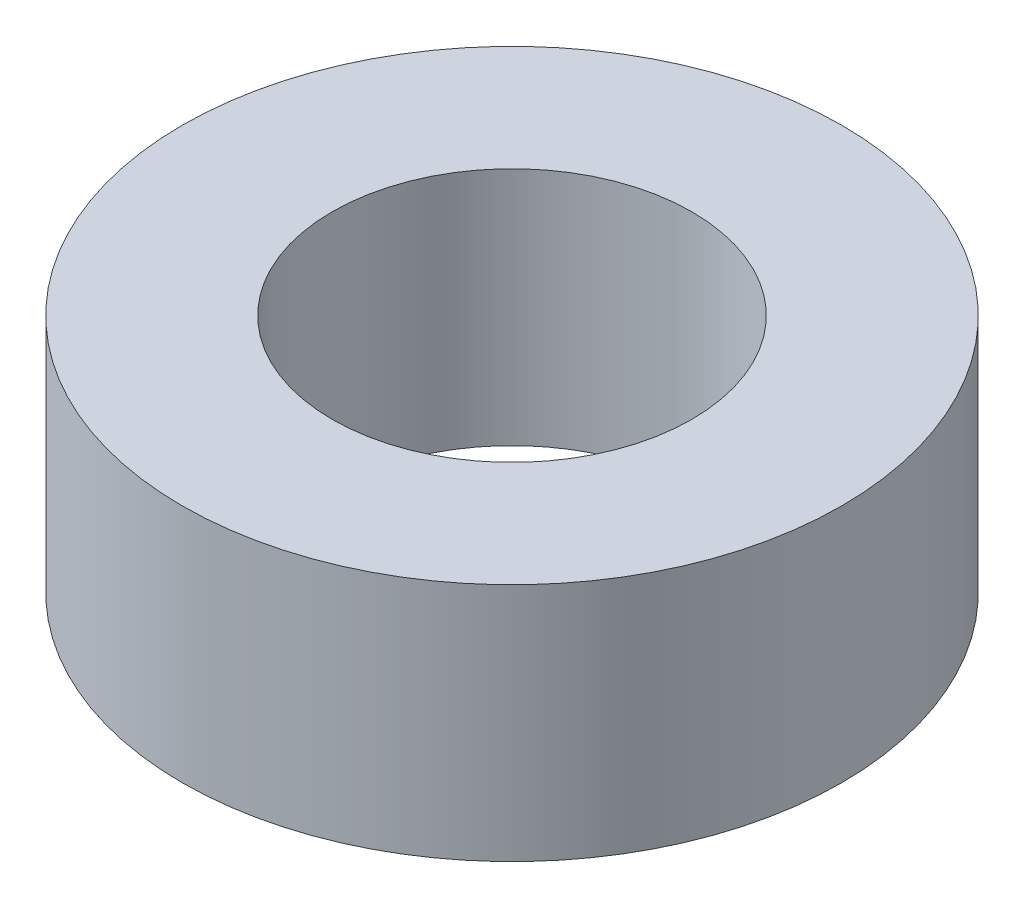
ISO-10303-21;
HEADER;
FILE_DESCRIPTION(('STEP AP214'),'2;1');
FILE_NAME('part.step','',(''),(''),'','','');
FILE_SCHEMA(('AUTOMOTIVE_DESIGN { 1 0 10303 214 1 1 1 1 }'));
ENDSEC;
DATA;
#1=APPLICATION_CONTEXT('core data for automotive mechanical design processes');
#2=APPLICATION_PROTOCOL_DEFINITION('international standard','automotive_design',2000,#1);
#3=PRODUCT_CONTEXT('',#1,'mechanical');
#4=PRODUCT('Part','Part','',(#3));
#5=PRODUCT_RELATED_PRODUCT_CATEGORY('part','',(#4));
#6=PRODUCT_DEFINITION_FORMATION('','',#4);
#7=PRODUCT_DEFINITION_CONTEXT('part definition',#1,'design');
#8=PRODUCT_DEFINITION('design','',#6,#7);
#9=PRODUCT_DEFINITION_SHAPE('','',#8);
#10=(LENGTH_UNIT() NAMED_UNIT(*) SI_UNIT(.MILLI.,.METRE.));
#11=(NAMED_UNIT(*) PLANE_ANGLE_UNIT() SI_UNIT($,.RADIAN.));
#12=(NAMED_UNIT(*) SI_UNIT($,.STERADIAN.) SOLID_ANGLE_UNIT());
#13=UNCERTAINTY_MEASURE_WITH_UNIT(LENGTH_MEASURE(1.E-05),#10,'distance_accuracy_value','');
#14=(GEOMETRIC_REPRESENTATION_CONTEXT(3) GLOBAL_UNCERTAINTY_ASSIGNED_CONTEXT((#13)) GLOBAL_UNIT_ASSIGNED_CONTEXT((#10,
#11,#12)) REPRESENTATION_CONTEXT('',''));
#15=CARTESIAN_POINT('',(0.,0.,0.));
#16=DIRECTION('',(0.,0.,1.));
#17=DIRECTION('',(1.,0.,0.));
#18=AXIS2_PLACEMENT_3D('',#15,#16,#17);
#19=CARTESIAN_POINT('',(0.,4.,0.));
#20=DIRECTION('',(0.,1.,0.));
#21=DIRECTION('',(0.,0.,1.));
#22=AXIS2_PLACEMENT_3D('',#19,#20,#21);
#23=PLANE('',#22);
#24=CARTESIAN_POINT('',(0.,4.,0.));
#25=DIRECTION('',(0.,1.,0.));
#26=DIRECTION('',(0.,0.,1.));
#27=AXIS2_PLACEMENT_3D('',#24,#25,#26);
#28=CIRCLE('',#27,5.5);
#29=CARTESIAN_POINT('',(0.,4.,5.5));
#30=VERTEX_POINT('',#29);
#31=EDGE_CURVE('E10',#30,#30,#28,.T.);
#32=ORIENTED_EDGE('',*,*,#31,.T.);
#33=EDGE_LOOP('',(#32));
#34=FACE_BOUND('',#33,.T.);
#35=CARTESIAN_POINT('',(0.,4.,0.));
#36=DIRECTION('',(0.,1.,0.));
#37=DIRECTION('',(0.,0.,1.));
#38=AXIS2_PLACEMENT_3D('',#35,#36,#37);
#39=CIRCLE('',#38,3.);
#40=CARTESIAN_POINT('',(0.,4.,3.));
#41=VERTEX_POINT('',#40);
#42=EDGE_CURVE('E42',#41,#41,#39,.T.);
#43=ORIENTED_EDGE('',*,*,#42,.F.);
#44=EDGE_LOOP('',(#43));
#45=FACE_BOUND('',#44,.T.);
#46=ADVANCED_FACE('F31',(#34,#45),#23,.T.);
#47=CARTESIAN_POINT('',(0.,0.,0.));
#48=DIRECTION('',(0.,1.,0.));
#49=DIRECTION('',(0.,0.,1.));
#50=AXIS2_PLACEMENT_3D('',#47,#48,#49);
#51=PLANE('',#50);
#52=CARTESIAN_POINT('',(0.,0.,0.));
#53=DIRECTION('',(0.,1.,0.));
#54=DIRECTION('',(0.,0.,1.));
#55=AXIS2_PLACEMENT_3D('',#52,#53,#54);
#56=CIRCLE('',#55,5.5);
#57=CARTESIAN_POINT('',(0.,0.,5.5));
#58=VERTEX_POINT('',#57);
#59=EDGE_CURVE('E35',#58,#58,#56,.T.);
#60=ORIENTED_EDGE('',*,*,#59,.F.);
#61=EDGE_LOOP('',(#60));
#62=FACE_BOUND('',#61,.T.);
#63=CARTESIAN_POINT('',(0.,0.,0.));
#64=DIRECTION('',(0.,1.,0.));
#65=DIRECTION('',(0.,0.,1.));
#66=AXIS2_PLACEMENT_3D('',#63,#64,#65);
#67=CIRCLE('',#66,3.);
#68=CARTESIAN_POINT('',(0.,0.,3.));
#69=VERTEX_POINT('',#68);
#70=EDGE_CURVE('E44',#69,#69,#67,.T.);
#71=ORIENTED_EDGE('',*,*,#70,.T.);
#72=EDGE_LOOP('',(#71));
#73=FACE_BOUND('',#72,.T.);
#74=ADVANCED_FACE('F54',(#62,#73),#51,.F.);
#75=CARTESIAN_POINT('',(0.,4.,0.));
#76=DIRECTION('',(0.,-1.,0.));
#77=DIRECTION('',(0.,0.,-1.));
#78=AXIS2_PLACEMENT_3D('',#75,#76,#77);
#79=CYLINDRICAL_SURFACE('',#78,5.5);
#80=ORIENTED_EDGE('',*,*,#31,.F.);
#81=EDGE_LOOP('',(#80));
#82=FACE_BOUND('',#81,.T.);
#83=ORIENTED_EDGE('',*,*,#59,.T.);
#84=EDGE_LOOP('',(#83));
#85=FACE_BOUND('',#84,.T.);
#86=ADVANCED_FACE('F33',(#82,#85),#79,.T.);
#87=CARTESIAN_POINT('',(0.,4.,0.));
#88=DIRECTION('',(0.,-1.,0.));
#89=DIRECTION('',(0.,0.,-1.));
#90=AXIS2_PLACEMENT_3D('',#87,#88,#89);
#91=CYLINDRICAL_SURFACE('',#90,3.);
#92=ORIENTED_EDGE('',*,*,#42,.T.);
#93=EDGE_LOOP('',(#92));
#94=FACE_BOUND('',#93,.T.);
#95=ORIENTED_EDGE('',*,*,#70,.F.);
#96=EDGE_LOOP('',(#95));
#97=FACE_BOUND('',#96,.T.);
#98=ADVANCED_FACE('F50',(#94,#97),#91,.F.);
#99=CLOSED_SHELL('',(#46,#74,#86,#98));
#100=MANIFOLD_SOLID_BREP('B2',#99);
#101=ADVANCED_BREP_SHAPE_REPRESENTATION('',(#18,#100),#14);
#102=SHAPE_DEFINITION_REPRESENTATION(#9,#101);
ENDSEC;
END-ISO-10303-21;
